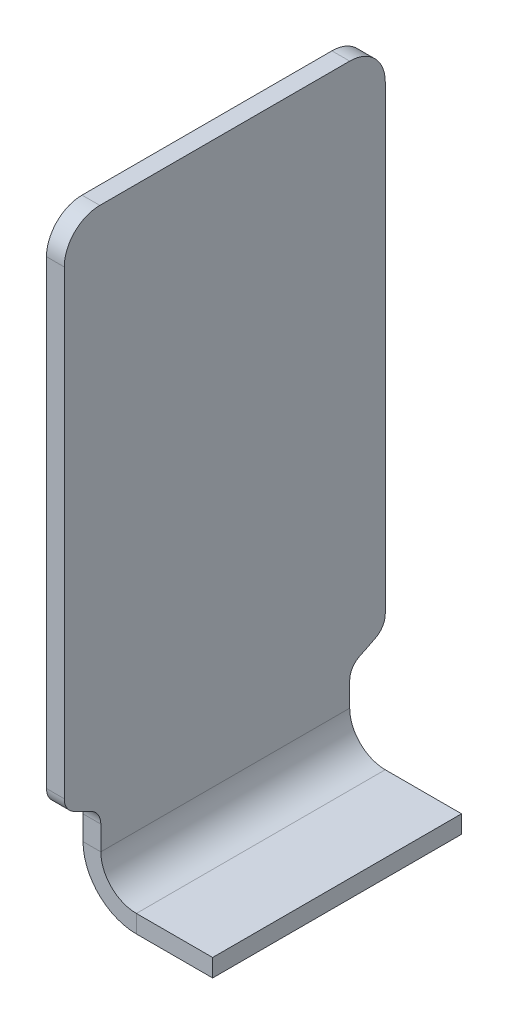
ISO-10303-21;
HEADER;
FILE_DESCRIPTION(('STEP AP214'),'2;1');
FILE_NAME('part.step','',(''),(''),'','','');
FILE_SCHEMA(('AUTOMOTIVE_DESIGN { 1 0 10303 214 1 1 1 1 }'));
ENDSEC;
DATA;
#1=APPLICATION_CONTEXT('core data for automotive mechanical design processes');
#2=APPLICATION_PROTOCOL_DEFINITION('international standard','automotive_design',2000,#1);
#3=PRODUCT_CONTEXT('',#1,'mechanical');
#4=PRODUCT('Part','Part','',(#3));
#5=PRODUCT_RELATED_PRODUCT_CATEGORY('part','',(#4));
#6=PRODUCT_DEFINITION_FORMATION('','',#4);
#7=PRODUCT_DEFINITION_CONTEXT('part definition',#1,'design');
#8=PRODUCT_DEFINITION('design','',#6,#7);
#9=PRODUCT_DEFINITION_SHAPE('','',#8);
#10=(LENGTH_UNIT() NAMED_UNIT(*) SI_UNIT(.MILLI.,.METRE.));
#11=(NAMED_UNIT(*) PLANE_ANGLE_UNIT() SI_UNIT($,.RADIAN.));
#12=(NAMED_UNIT(*) SI_UNIT($,.STERADIAN.) SOLID_ANGLE_UNIT());
#13=UNCERTAINTY_MEASURE_WITH_UNIT(LENGTH_MEASURE(1.E-05),#10,'distance_accuracy_value','');
#14=(GEOMETRIC_REPRESENTATION_CONTEXT(3) GLOBAL_UNCERTAINTY_ASSIGNED_CONTEXT((#13)) GLOBAL_UNIT_ASSIGNED_CONTEXT((#10,
#11,#12)) REPRESENTATION_CONTEXT('',''));
#15=CARTESIAN_POINT('',(0.,0.,0.));
#16=DIRECTION('',(0.,0.,1.));
#17=DIRECTION('',(1.,0.,0.));
#18=AXIS2_PLACEMENT_3D('',#15,#16,#17);
#19=CARTESIAN_POINT('',(-15.725,-5.,35.));
#20=DIRECTION('',(0.,0.,1.));
#21=DIRECTION('',(1.,0.,0.));
#22=AXIS2_PLACEMENT_3D('',#19,#20,#21);
#23=PLANE('',#22);
#24=DIRECTION('',(1.,0.,0.));
#25=VECTOR('',#24,1.);
#26=CARTESIAN_POINT('',(-15.725,0.,35.));
#27=LINE('',#26,#25);
#28=CARTESIAN_POINT('',(-5.72500000000003,0.,35.));
#29=VERTEX_POINT('',#28);
#30=CARTESIAN_POINT('',(15.725,0.,35.));
#31=VERTEX_POINT('',#30);
#32=EDGE_CURVE('E229',#29,#31,#27,.T.);
#33=ORIENTED_EDGE('',*,*,#32,.F.);
#34=DIRECTION('',(0.,-1.,0.));
#35=VECTOR('',#34,1.);
#36=CARTESIAN_POINT('',(-5.72500000000003,0.,35.));
#37=LINE('',#36,#35);
#38=CARTESIAN_POINT('',(-5.72500000000003,-5.,35.));
#39=VERTEX_POINT('',#38);
#40=EDGE_CURVE('E212',#29,#39,#37,.T.);
#41=ORIENTED_EDGE('',*,*,#40,.T.);
#42=DIRECTION('',(1.,0.,0.));
#43=VECTOR('',#42,1.);
#44=CARTESIAN_POINT('',(-15.725,-5.,35.));
#45=LINE('',#44,#43);
#46=CARTESIAN_POINT('',(15.725,-5.,35.));
#47=VERTEX_POINT('',#46);
#48=EDGE_CURVE('E233',#39,#47,#45,.T.);
#49=ORIENTED_EDGE('',*,*,#48,.T.);
#50=DIRECTION('',(0.,1.,0.));
#51=VECTOR('',#50,1.);
#52=CARTESIAN_POINT('',(15.725,-5.,35.));
#53=LINE('',#52,#51);
#54=EDGE_CURVE('E245',#47,#31,#53,.T.);
#55=ORIENTED_EDGE('',*,*,#54,.T.);
#56=EDGE_LOOP('',(#33,#41,#49,#55));
#57=FACE_BOUND('',#56,.T.);
#58=ADVANCED_FACE('F43',(#57),#23,.T.);
#59=CARTESIAN_POINT('',(0.,-5.,0.));
#60=DIRECTION('',(0.,-1.,0.));
#61=DIRECTION('',(0.,0.,-1.));
#62=AXIS2_PLACEMENT_3D('',#59,#60,#61);
#63=PLANE('',#62);
#64=ORIENTED_EDGE('',*,*,#48,.F.);
#65=DIRECTION('',(0.,0.,1.));
#66=VECTOR('',#65,1.);
#67=CARTESIAN_POINT('',(-5.72500000000003,-5.,35.));
#68=LINE('',#67,#66);
#69=CARTESIAN_POINT('',(-5.72500000000003,-5.,-35.));
#70=VERTEX_POINT('',#69);
#71=EDGE_CURVE('E171',#39,#70,#68,.F.);
#72=ORIENTED_EDGE('',*,*,#71,.T.);
#73=DIRECTION('',(-1.,0.,0.));
#74=VECTOR('',#73,1.);
#75=CARTESIAN_POINT('',(-15.725,-5.,-35.));
#76=LINE('',#75,#74);
#77=CARTESIAN_POINT('',(15.725,-5.,-35.));
#78=VERTEX_POINT('',#77);
#79=EDGE_CURVE('E227',#78,#70,#76,.T.);
#80=ORIENTED_EDGE('',*,*,#79,.F.);
#81=DIRECTION('',(0.,0.,-1.));
#82=VECTOR('',#81,1.);
#83=CARTESIAN_POINT('',(15.725,-5.,35.));
#84=LINE('',#83,#82);
#85=EDGE_CURVE('E228',#47,#78,#84,.T.);
#86=ORIENTED_EDGE('',*,*,#85,.F.);
#87=EDGE_LOOP('',(#64,#72,#80,#86));
#88=FACE_BOUND('',#87,.T.);
#89=ADVANCED_FACE('F355',(#88),#63,.T.);
#90=CARTESIAN_POINT('',(0.,0.,0.));
#91=DIRECTION('',(0.,-1.,0.));
#92=DIRECTION('',(0.,0.,-1.));
#93=AXIS2_PLACEMENT_3D('',#90,#91,#92);
#94=PLANE('',#93);
#95=DIRECTION('',(0.,0.,1.));
#96=VECTOR('',#95,1.);
#97=CARTESIAN_POINT('',(-5.72500000000003,0.,35.));
#98=LINE('',#97,#96);
#99=CARTESIAN_POINT('',(-5.72500000000003,0.,-35.));
#100=VERTEX_POINT('',#99);
#101=EDGE_CURVE('E217',#29,#100,#98,.F.);
#102=ORIENTED_EDGE('',*,*,#101,.F.);
#103=ORIENTED_EDGE('',*,*,#32,.T.);
#104=DIRECTION('',(0.,0.,-1.));
#105=VECTOR('',#104,1.);
#106=CARTESIAN_POINT('',(15.725,0.,35.));
#107=LINE('',#106,#105);
#108=CARTESIAN_POINT('',(15.725,0.,-35.));
#109=VERTEX_POINT('',#108);
#110=EDGE_CURVE('E221',#31,#109,#107,.T.);
#111=ORIENTED_EDGE('',*,*,#110,.T.);
#112=DIRECTION('',(-1.,0.,0.));
#113=VECTOR('',#112,1.);
#114=CARTESIAN_POINT('',(-15.725,0.,-35.));
#115=LINE('',#114,#113);
#116=EDGE_CURVE('E236',#109,#100,#115,.T.);
#117=ORIENTED_EDGE('',*,*,#116,.T.);
#118=EDGE_LOOP('',(#102,#103,#111,#117));
#119=FACE_BOUND('',#118,.T.);
#120=ADVANCED_FACE('F357',(#119),#94,.F.);
#121=CARTESIAN_POINT('',(15.725,-5.,35.));
#122=DIRECTION('',(1.,0.,0.));
#123=DIRECTION('',(0.,0.,-1.));
#124=AXIS2_PLACEMENT_3D('',#121,#122,#123);
#125=PLANE('',#124);
#126=ORIENTED_EDGE('',*,*,#110,.F.);
#127=ORIENTED_EDGE('',*,*,#54,.F.);
#128=ORIENTED_EDGE('',*,*,#85,.T.);
#129=DIRECTION('',(0.,1.,0.));
#130=VECTOR('',#129,1.);
#131=CARTESIAN_POINT('',(15.725,-5.,-35.));
#132=LINE('',#131,#130);
#133=EDGE_CURVE('E231',#78,#109,#132,.T.);
#134=ORIENTED_EDGE('',*,*,#133,.T.);
#135=EDGE_LOOP('',(#126,#127,#128,#134));
#136=FACE_BOUND('',#135,.T.);
#137=ADVANCED_FACE('F369',(#136),#125,.T.);
#138=CARTESIAN_POINT('',(-15.725,-5.,-35.));
#139=DIRECTION('',(0.,0.,-1.));
#140=DIRECTION('',(-1.,0.,0.));
#141=AXIS2_PLACEMENT_3D('',#138,#139,#140);
#142=PLANE('',#141);
#143=DIRECTION('',(0.,-1.,0.));
#144=VECTOR('',#143,1.);
#145=CARTESIAN_POINT('',(-5.72500000000003,0.,-35.));
#146=LINE('',#145,#144);
#147=EDGE_CURVE('E222',#100,#70,#146,.T.);
#148=ORIENTED_EDGE('',*,*,#147,.F.);
#149=ORIENTED_EDGE('',*,*,#116,.F.);
#150=ORIENTED_EDGE('',*,*,#133,.F.);
#151=ORIENTED_EDGE('',*,*,#79,.T.);
#152=EDGE_LOOP('',(#148,#149,#150,#151));
#153=FACE_BOUND('',#152,.T.);
#154=ADVANCED_FACE('F364',(#153),#142,.T.);
#155=CARTESIAN_POINT('',(-5.72500000000003,10.,-35.));
#156=DIRECTION('',(0.,0.,-1.));
#157=DIRECTION('',(-1.,0.,0.));
#158=AXIS2_PLACEMENT_3D('',#155,#156,#157);
#159=PLANE('',#158);
#160=DIRECTION('',(-1.,0.,0.));
#161=VECTOR('',#160,1.);
#162=CARTESIAN_POINT('',(-15.725,9.99999999999997,-35.));
#163=LINE('',#162,#161);
#164=CARTESIAN_POINT('',(-15.725,9.99999999999997,-35.));
#165=VERTEX_POINT('',#164);
#166=CARTESIAN_POINT('',(-20.725,9.99999999999995,-35.));
#167=VERTEX_POINT('',#166);
#168=EDGE_CURVE('E320',#165,#167,#163,.T.);
#169=ORIENTED_EDGE('',*,*,#168,.F.);
#170=CARTESIAN_POINT('',(-5.72500000000003,10.,-35.));
#171=DIRECTION('',(0.,0.,1.));
#172=DIRECTION('',(1.,0.,0.));
#173=AXIS2_PLACEMENT_3D('',#170,#171,#172);
#174=CIRCLE('',#173,10.);
#175=EDGE_CURVE('E177',#100,#165,#174,.F.);
#176=ORIENTED_EDGE('',*,*,#175,.F.);
#177=ORIENTED_EDGE('',*,*,#147,.T.);
#178=CARTESIAN_POINT('',(-5.72500000000003,10.,-35.));
#179=DIRECTION('',(0.,0.,1.));
#180=DIRECTION('',(1.,0.,0.));
#181=AXIS2_PLACEMENT_3D('',#178,#179,#180);
#182=CIRCLE('',#181,15.);
#183=EDGE_CURVE('E213',#70,#167,#182,.F.);
#184=ORIENTED_EDGE('',*,*,#183,.T.);
#185=EDGE_LOOP('',(#169,#176,#177,#184));
#186=FACE_BOUND('',#185,.T.);
#187=ADVANCED_FACE('F366',(#186),#159,.T.);
#188=CARTESIAN_POINT('',(-5.72500000000003,10.,35.));
#189=DIRECTION('',(0.,0.,-1.));
#190=DIRECTION('',(-1.,0.,0.));
#191=AXIS2_PLACEMENT_3D('',#188,#189,#190);
#192=PLANE('',#191);
#193=CARTESIAN_POINT('',(-5.72500000000003,10.,35.));
#194=DIRECTION('',(0.,0.,1.));
#195=DIRECTION('',(1.,0.,0.));
#196=AXIS2_PLACEMENT_3D('',#193,#194,#195);
#197=CIRCLE('',#196,10.);
#198=CARTESIAN_POINT('',(-15.725,9.99999999999997,35.));
#199=VERTEX_POINT('',#198);
#200=EDGE_CURVE('E181',#199,#29,#197,.T.);
#201=ORIENTED_EDGE('',*,*,#200,.F.);
#202=DIRECTION('',(-1.,0.,0.));
#203=VECTOR('',#202,1.);
#204=CARTESIAN_POINT('',(-15.725,9.99999999999997,35.));
#205=LINE('',#204,#203);
#206=CARTESIAN_POINT('',(-20.725,9.99999999999995,35.));
#207=VERTEX_POINT('',#206);
#208=EDGE_CURVE('E176',#199,#207,#205,.T.);
#209=ORIENTED_EDGE('',*,*,#208,.T.);
#210=CARTESIAN_POINT('',(-5.72500000000003,10.,35.));
#211=DIRECTION('',(0.,0.,1.));
#212=DIRECTION('',(1.,0.,0.));
#213=AXIS2_PLACEMENT_3D('',#210,#211,#212);
#214=CIRCLE('',#213,15.);
#215=EDGE_CURVE('E167',#207,#39,#214,.T.);
#216=ORIENTED_EDGE('',*,*,#215,.T.);
#217=ORIENTED_EDGE('',*,*,#40,.F.);
#218=EDGE_LOOP('',(#201,#209,#216,#217));
#219=FACE_BOUND('',#218,.T.);
#220=ADVANCED_FACE('F182',(#219),#192,.F.);
#221=CARTESIAN_POINT('',(-5.72500000000003,10.,35.));
#222=DIRECTION('',(0.,0.,1.));
#223=DIRECTION('',(-1.,0.,0.));
#224=AXIS2_PLACEMENT_3D('',#221,#222,#223);
#225=CYLINDRICAL_SURFACE('',#224,15.);
#226=ORIENTED_EDGE('',*,*,#71,.F.);
#227=ORIENTED_EDGE('',*,*,#215,.F.);
#228=DIRECTION('',(0.,0.,-1.));
#229=VECTOR('',#228,1.);
#230=CARTESIAN_POINT('',(-20.725,9.99999999999995,0.));
#231=LINE('',#230,#229);
#232=EDGE_CURVE('E168',#207,#167,#231,.T.);
#233=ORIENTED_EDGE('',*,*,#232,.T.);
#234=ORIENTED_EDGE('',*,*,#183,.F.);
#235=EDGE_LOOP('',(#226,#227,#233,#234));
#236=FACE_BOUND('',#235,.T.);
#237=ADVANCED_FACE('F169',(#236),#225,.T.);
#238=CARTESIAN_POINT('',(-5.72500000000003,10.,35.));
#239=DIRECTION('',(0.,0.,1.));
#240=DIRECTION('',(-1.,0.,0.));
#241=AXIS2_PLACEMENT_3D('',#238,#239,#240);
#242=CYLINDRICAL_SURFACE('',#241,10.);
#243=ORIENTED_EDGE('',*,*,#101,.T.);
#244=ORIENTED_EDGE('',*,*,#175,.T.);
#245=DIRECTION('',(0.,0.,1.));
#246=VECTOR('',#245,1.);
#247=CARTESIAN_POINT('',(-15.725,9.99999999999997,-35.));
#248=LINE('',#247,#246);
#249=EDGE_CURVE('E186',#165,#199,#248,.T.);
#250=ORIENTED_EDGE('',*,*,#249,.T.);
#251=ORIENTED_EDGE('',*,*,#200,.T.);
#252=EDGE_LOOP('',(#243,#244,#250,#251));
#253=FACE_BOUND('',#252,.T.);
#254=ADVANCED_FACE('F417',(#253),#242,.F.);
#255=CARTESIAN_POINT('',(-20.7250000000006,167.6,35.));
#256=DIRECTION('',(0.,0.,-1.));
#257=DIRECTION('',(-1.,0.,0.));
#258=AXIS2_PLACEMENT_3D('',#255,#256,#257);
#259=PLANE('',#258);
#260=DIRECTION('',(0.,1.,0.));
#261=VECTOR('',#260,1.);
#262=CARTESIAN_POINT('',(-15.7250000000006,167.6,35.));
#263=LINE('',#262,#261);
#264=CARTESIAN_POINT('',(-15.7250000000001,16.7565603019629,35.));
#265=VERTEX_POINT('',#264);
#266=EDGE_CURVE('E194',#199,#265,#263,.T.);
#267=ORIENTED_EDGE('',*,*,#266,.T.);
#268=DIRECTION('',(-1.,0.,0.));
#269=VECTOR('',#268,1.);
#270=CARTESIAN_POINT('',(-20.7250000000001,16.7565603019629,35.));
#271=LINE('',#270,#269);
#272=CARTESIAN_POINT('',(-20.7250000000001,16.7565603019629,35.));
#273=VERTEX_POINT('',#272);
#274=EDGE_CURVE('E199',#265,#273,#271,.T.);
#275=ORIENTED_EDGE('',*,*,#274,.T.);
#276=DIRECTION('',(0.,1.,0.));
#277=VECTOR('',#276,1.);
#278=CARTESIAN_POINT('',(-20.7250000000006,167.6,35.));
#279=LINE('',#278,#277);
#280=EDGE_CURVE('E195',#207,#273,#279,.T.);
#281=ORIENTED_EDGE('',*,*,#280,.F.);
#282=ORIENTED_EDGE('',*,*,#208,.F.);
#283=EDGE_LOOP('',(#267,#275,#281,#282));
#284=FACE_BOUND('',#283,.T.);
#285=ADVANCED_FACE('F196',(#284),#259,.F.);
#286=CARTESIAN_POINT('',(-20.725,0.,-35.));
#287=DIRECTION('',(0.,0.,1.));
#288=DIRECTION('',(1.,0.,0.));
#289=AXIS2_PLACEMENT_3D('',#286,#287,#288);
#290=PLANE('',#289);
#291=DIRECTION('',(0.,-1.,0.));
#292=VECTOR('',#291,1.);
#293=CARTESIAN_POINT('',(-20.725,0.,-35.));
#294=LINE('',#293,#292);
#295=CARTESIAN_POINT('',(-20.7250000000001,16.7565603019744,-35.));
#296=VERTEX_POINT('',#295);
#297=EDGE_CURVE('E192',#296,#167,#294,.T.);
#298=ORIENTED_EDGE('',*,*,#297,.F.);
#299=DIRECTION('',(-1.,0.,0.));
#300=VECTOR('',#299,1.);
#301=CARTESIAN_POINT('',(-20.7250000000001,16.7565603019744,-35.));
#302=LINE('',#301,#300);
#303=CARTESIAN_POINT('',(-15.7250000000001,16.7565603019744,-35.));
#304=VERTEX_POINT('',#303);
#305=EDGE_CURVE('E244',#296,#304,#302,.F.);
#306=ORIENTED_EDGE('',*,*,#305,.T.);
#307=DIRECTION('',(0.,-1.,0.));
#308=VECTOR('',#307,1.);
#309=CARTESIAN_POINT('',(-15.725,0.,-35.));
#310=LINE('',#309,#308);
#311=EDGE_CURVE('E205',#304,#165,#310,.T.);
#312=ORIENTED_EDGE('',*,*,#311,.T.);
#313=ORIENTED_EDGE('',*,*,#168,.T.);
#314=EDGE_LOOP('',(#298,#306,#312,#313));
#315=FACE_BOUND('',#314,.T.);
#316=ADVANCED_FACE('F412',(#315),#290,.F.);
#317=CARTESIAN_POINT('',(-20.725,0.,0.));
#318=DIRECTION('',(1.,0.,0.));
#319=DIRECTION('',(0.,1.,0.));
#320=AXIS2_PLACEMENT_3D('',#317,#318,#319);
#321=PLANE('',#320);
#322=DIRECTION('',(0.,1.,0.));
#323=VECTOR('',#322,1.);
#324=CARTESIAN_POINT('',(-20.7250000000001,25.1453622540292,45.2805471709599));
#325=LINE('',#324,#323);
#326=CARTESIAN_POINT('',(-20.7250000000001,28.0753004708564,45.2805471709599));
#327=VERTEX_POINT('',#326);
#328=CARTESIAN_POINT('',(-20.7250000000005,157.6,45.2805471709599));
#329=VERTEX_POINT('',#328);
#330=EDGE_CURVE('E301',#327,#329,#325,.T.);
#331=ORIENTED_EDGE('',*,*,#330,.T.);
#332=CARTESIAN_POINT('',(-20.7250000000005,157.6,35.2805471709599));
#333=DIRECTION('',(1.,0.,0.));
#334=DIRECTION('',(0.,1.,0.));
#335=AXIS2_PLACEMENT_3D('',#332,#333,#334);
#336=CIRCLE('',#335,10.);
#337=CARTESIAN_POINT('',(-20.7250000000006,167.6,35.2805471709598));
#338=VERTEX_POINT('',#337);
#339=EDGE_CURVE('E64',#329,#338,#336,.F.);
#340=ORIENTED_EDGE('',*,*,#339,.T.);
#341=DIRECTION('',(0.,0.,-1.));
#342=VECTOR('',#341,1.);
#343=CARTESIAN_POINT('',(-20.7250000000006,167.6,-35.));
#344=LINE('',#343,#342);
#345=CARTESIAN_POINT('',(-20.7250000000006,167.6,-35.));
#346=VERTEX_POINT('',#345);
#347=EDGE_CURVE('E203',#338,#346,#344,.T.);
#348=ORIENTED_EDGE('',*,*,#347,.T.);
#349=CARTESIAN_POINT('',(-20.7250000000005,157.6,-35.));
#350=DIRECTION('',(1.,0.,0.));
#351=DIRECTION('',(0.,1.,0.));
#352=AXIS2_PLACEMENT_3D('',#349,#350,#351);
#353=CIRCLE('',#352,10.);
#354=CARTESIAN_POINT('',(-20.7250000000005,157.6,-45.));
#355=VERTEX_POINT('',#354);
#356=EDGE_CURVE('E287',#346,#355,#353,.F.);
#357=ORIENTED_EDGE('',*,*,#356,.T.);
#358=DIRECTION('',(0.,-1.,0.));
#359=VECTOR('',#358,1.);
#360=CARTESIAN_POINT('',(-20.7250000000006,167.6,-45.));
#361=LINE('',#360,#359);
#362=CARTESIAN_POINT('',(-20.7250000000001,27.9250000000467,-45.));
#363=VERTEX_POINT('',#362);
#364=EDGE_CURVE('E322',#355,#363,#361,.T.);
#365=ORIENTED_EDGE('',*,*,#364,.T.);
#366=CARTESIAN_POINT('',(-20.7250000000001,27.9250000000467,-40.));
#367=DIRECTION('',(1.,0.,0.));
#368=DIRECTION('',(0.,1.,0.));
#369=AXIS2_PLACEMENT_3D('',#366,#367,#368);
#370=CIRCLE('',#369,5.);
#371=CARTESIAN_POINT('',(-20.7250000000001,23.5132352941652,-42.3529411764722));
#372=VERTEX_POINT('',#371);
#373=EDGE_CURVE('E277',#363,#372,#370,.F.);
#374=ORIENTED_EDGE('',*,*,#373,.T.);
#375=CARTESIAN_POINT('',(-20.7250000000004,102.925000000005,1.24344978758018E-11));
#376=DIRECTION('',(-1.,0.,0.));
#377=DIRECTION('',(0.,1.,0.));
#378=AXIS2_PLACEMENT_3D('',#375,#376,#377);
#379=CIRCLE('',#378,89.999999999969);
#380=CARTESIAN_POINT('',(-20.7250000000001,21.2917413387144,-37.8947368421039));
#381=VERTEX_POINT('',#380);
#382=EDGE_CURVE('E310',#372,#381,#379,.T.);
#383=ORIENTED_EDGE('',*,*,#382,.T.);
#384=CARTESIAN_POINT('',(-20.7250000000001,16.7565603019744,-40.));
#385=DIRECTION('',(1.,0.,0.));
#386=DIRECTION('',(0.,1.,0.));
#387=AXIS2_PLACEMENT_3D('',#384,#385,#386);
#388=CIRCLE('',#387,5.);
#389=EDGE_CURVE('E254',#381,#296,#388,.T.);
#390=ORIENTED_EDGE('',*,*,#389,.T.);
#391=ORIENTED_EDGE('',*,*,#297,.T.);
#392=ORIENTED_EDGE('',*,*,#232,.F.);
#393=ORIENTED_EDGE('',*,*,#280,.T.);
#394=CARTESIAN_POINT('',(-20.7250000000001,16.7565603019629,40.));
#395=DIRECTION('',(1.,0.,0.));
#396=DIRECTION('',(0.,1.,0.));
#397=AXIS2_PLACEMENT_3D('',#394,#395,#396);
#398=CIRCLE('',#397,5.);
#399=CARTESIAN_POINT('',(-20.7250000000001,21.2917413387034,37.8947368421052));
#400=VERTEX_POINT('',#399);
#401=EDGE_CURVE('E257',#273,#400,#398,.T.);
#402=ORIENTED_EDGE('',*,*,#401,.T.);
#403=CARTESIAN_POINT('',(-20.7250000000001,23.6723769691402,42.6499911221929));
#404=VERTEX_POINT('',#403);
#405=EDGE_CURVE('E311',#400,#404,#379,.T.);
#406=ORIENTED_EDGE('',*,*,#405,.T.);
#407=CARTESIAN_POINT('',(-20.7250000000001,28.0753004708564,40.2805471709599));
#408=DIRECTION('',(1.,0.,0.));
#409=DIRECTION('',(0.,1.,0.));
#410=AXIS2_PLACEMENT_3D('',#407,#408,#409);
#411=CIRCLE('',#410,5.);
#412=EDGE_CURVE('E270',#404,#327,#411,.F.);
#413=ORIENTED_EDGE('',*,*,#412,.T.);
#414=EDGE_LOOP('',(#331,#340,#348,#357,#365,#374,#383,#390,#391,#392,#393,#402,#406,#413));
#415=FACE_BOUND('',#414,.T.);
#416=ADVANCED_FACE('F191',(#415),#321,.F.);
#417=CARTESIAN_POINT('',(-15.725,0.,0.));
#418=DIRECTION('',(1.,0.,0.));
#419=DIRECTION('',(0.,1.,0.));
#420=AXIS2_PLACEMENT_3D('',#417,#418,#419);
#421=PLANE('',#420);
#422=DIRECTION('',(0.,0.,-1.));
#423=VECTOR('',#422,1.);
#424=CARTESIAN_POINT('',(-15.7250000000006,167.6,-35.));
#425=LINE('',#424,#423);
#426=CARTESIAN_POINT('',(-15.7250000000006,167.6,35.2805471709598));
#427=VERTEX_POINT('',#426);
#428=CARTESIAN_POINT('',(-15.7250000000006,167.6,-35.));
#429=VERTEX_POINT('',#428);
#430=EDGE_CURVE('E202',#427,#429,#425,.T.);
#431=ORIENTED_EDGE('',*,*,#430,.F.);
#432=CARTESIAN_POINT('',(-15.7250000000005,157.6,35.2805471709599));
#433=DIRECTION('',(1.,0.,0.));
#434=DIRECTION('',(0.,1.,0.));
#435=AXIS2_PLACEMENT_3D('',#432,#433,#434);
#436=CIRCLE('',#435,10.);
#437=CARTESIAN_POINT('',(-15.7250000000005,157.6,45.2805471709599));
#438=VERTEX_POINT('',#437);
#439=EDGE_CURVE('E11',#427,#438,#436,.T.);
#440=ORIENTED_EDGE('',*,*,#439,.T.);
#441=DIRECTION('',(0.,1.,0.));
#442=VECTOR('',#441,1.);
#443=CARTESIAN_POINT('',(-15.7250000000001,25.1453622540292,45.2805471709599));
#444=LINE('',#443,#442);
#445=CARTESIAN_POINT('',(-15.7250000000001,28.0753004708565,45.2805471709599));
#446=VERTEX_POINT('',#445);
#447=EDGE_CURVE('E302',#446,#438,#444,.T.);
#448=ORIENTED_EDGE('',*,*,#447,.F.);
#449=CARTESIAN_POINT('',(-15.7250000000001,28.0753004708565,40.2805471709599));
#450=DIRECTION('',(1.,0.,0.));
#451=DIRECTION('',(0.,1.,0.));
#452=AXIS2_PLACEMENT_3D('',#449,#450,#451);
#453=CIRCLE('',#452,5.);
#454=CARTESIAN_POINT('',(-15.7250000000001,23.6723769691473,42.6499911221891));
#455=VERTEX_POINT('',#454);
#456=EDGE_CURVE('E271',#446,#455,#453,.T.);
#457=ORIENTED_EDGE('',*,*,#456,.T.);
#458=CARTESIAN_POINT('',(-15.7250000000004,102.925000000005,1.24344978758018E-11));
#459=DIRECTION('',(-1.,0.,0.));
#460=DIRECTION('',(0.,-1.,0.));
#461=AXIS2_PLACEMENT_3D('',#458,#459,#460);
#462=CIRCLE('',#461,89.999999999961);
#463=CARTESIAN_POINT('',(-15.7250000000001,21.2917413387107,37.8947368421018));
#464=VERTEX_POINT('',#463);
#465=EDGE_CURVE('E313',#464,#455,#462,.T.);
#466=ORIENTED_EDGE('',*,*,#465,.F.);
#467=CARTESIAN_POINT('',(-15.7250000000001,16.7565603019629,40.));
#468=DIRECTION('',(1.,0.,0.));
#469=DIRECTION('',(0.,1.,0.));
#470=AXIS2_PLACEMENT_3D('',#467,#468,#469);
#471=CIRCLE('',#470,5.);
#472=EDGE_CURVE('E265',#464,#265,#471,.F.);
#473=ORIENTED_EDGE('',*,*,#472,.T.);
#474=ORIENTED_EDGE('',*,*,#266,.F.);
#475=ORIENTED_EDGE('',*,*,#249,.F.);
#476=ORIENTED_EDGE('',*,*,#311,.F.);
#477=CARTESIAN_POINT('',(-15.7250000000001,16.7565603019744,-40.));
#478=DIRECTION('',(1.,0.,0.));
#479=DIRECTION('',(0.,1.,0.));
#480=AXIS2_PLACEMENT_3D('',#477,#478,#479);
#481=CIRCLE('',#480,5.);
#482=CARTESIAN_POINT('',(-15.7250000000001,21.2917413387217,-37.8947368421005));
#483=VERTEX_POINT('',#482);
#484=EDGE_CURVE('E252',#304,#483,#481,.F.);
#485=ORIENTED_EDGE('',*,*,#484,.T.);
#486=CARTESIAN_POINT('',(-15.7250000000001,23.5132352941723,-42.3529411764684));
#487=VERTEX_POINT('',#486);
#488=EDGE_CURVE('E321',#487,#483,#462,.T.);
#489=ORIENTED_EDGE('',*,*,#488,.F.);
#490=CARTESIAN_POINT('',(-15.7250000000001,27.9250000000467,-40.));
#491=DIRECTION('',(1.,0.,0.));
#492=DIRECTION('',(0.,1.,0.));
#493=AXIS2_PLACEMENT_3D('',#490,#491,#492);
#494=CIRCLE('',#493,5.);
#495=CARTESIAN_POINT('',(-15.7250000000001,27.9250000000467,-45.));
#496=VERTEX_POINT('',#495);
#497=EDGE_CURVE('E278',#487,#496,#494,.T.);
#498=ORIENTED_EDGE('',*,*,#497,.T.);
#499=DIRECTION('',(0.,-1.,0.));
#500=VECTOR('',#499,1.);
#501=CARTESIAN_POINT('',(-15.7250000000006,167.6,-45.));
#502=LINE('',#501,#500);
#503=CARTESIAN_POINT('',(-15.7250000000005,157.6,-45.));
#504=VERTEX_POINT('',#503);
#505=EDGE_CURVE('E306',#504,#496,#502,.T.);
#506=ORIENTED_EDGE('',*,*,#505,.F.);
#507=CARTESIAN_POINT('',(-15.7250000000005,157.6,-35.));
#508=DIRECTION('',(1.,0.,0.));
#509=DIRECTION('',(0.,1.,0.));
#510=AXIS2_PLACEMENT_3D('',#507,#508,#509);
#511=CIRCLE('',#510,10.);
#512=EDGE_CURVE('E286',#504,#429,#511,.T.);
#513=ORIENTED_EDGE('',*,*,#512,.T.);
#514=EDGE_LOOP('',(#431,#440,#448,#457,#466,#473,#474,#475,#476,#485,#489,#498,#506,#513));
#515=FACE_BOUND('',#514,.T.);
#516=ADVANCED_FACE('F336',(#515),#421,.T.);
#517=CARTESIAN_POINT('',(-20.7250000000006,167.6,-35.));
#518=DIRECTION('',(0.,-1.,0.));
#519=DIRECTION('',(1.,0.,0.));
#520=AXIS2_PLACEMENT_3D('',#517,#518,#519);
#521=PLANE('',#520);
#522=ORIENTED_EDGE('',*,*,#347,.F.);
#523=DIRECTION('',(-1.,0.,0.));
#524=VECTOR('',#523,1.);
#525=CARTESIAN_POINT('',(-15.7250000000006,167.6,35.2805471709599));
#526=LINE('',#525,#524);
#527=EDGE_CURVE('E51',#338,#427,#526,.F.);
#528=ORIENTED_EDGE('',*,*,#527,.T.);
#529=ORIENTED_EDGE('',*,*,#430,.T.);
#530=DIRECTION('',(-1.,0.,0.));
#531=VECTOR('',#530,1.);
#532=CARTESIAN_POINT('',(-20.7250000000006,167.6,-35.));
#533=LINE('',#532,#531);
#534=EDGE_CURVE('E281',#429,#346,#533,.T.);
#535=ORIENTED_EDGE('',*,*,#534,.T.);
#536=EDGE_LOOP('',(#522,#528,#529,#535));
#537=FACE_BOUND('',#536,.T.);
#538=ADVANCED_FACE('F404',(#537),#521,.F.);
#539=CARTESIAN_POINT('',(-15.7250000000006,167.6,-45.));
#540=DIRECTION('',(0.,0.,-1.));
#541=DIRECTION('',(-1.,0.,0.));
#542=AXIS2_PLACEMENT_3D('',#539,#540,#541);
#543=PLANE('',#542);
#544=ORIENTED_EDGE('',*,*,#364,.F.);
#545=DIRECTION('',(-1.,0.,0.));
#546=VECTOR('',#545,1.);
#547=CARTESIAN_POINT('',(-15.7250000000005,157.6,-45.));
#548=LINE('',#547,#546);
#549=EDGE_CURVE('E288',#355,#504,#548,.F.);
#550=ORIENTED_EDGE('',*,*,#549,.T.);
#551=ORIENTED_EDGE('',*,*,#505,.T.);
#552=DIRECTION('',(-1.,0.,0.));
#553=VECTOR('',#552,1.);
#554=CARTESIAN_POINT('',(-15.7250000000001,27.9250000000467,-45.));
#555=LINE('',#554,#553);
#556=EDGE_CURVE('E272',#496,#363,#555,.T.);
#557=ORIENTED_EDGE('',*,*,#556,.T.);
#558=EDGE_LOOP('',(#544,#550,#551,#557));
#559=FACE_BOUND('',#558,.T.);
#560=ADVANCED_FACE('F396',(#559),#543,.T.);
#561=CARTESIAN_POINT('',(-15.7250000000004,102.925000000005,1.24344978758018E-11));
#562=DIRECTION('',(-1.,0.,0.));
#563=DIRECTION('',(0.,-1.,0.));
#564=AXIS2_PLACEMENT_3D('',#561,#562,#563);
#565=CYLINDRICAL_SURFACE('',#564,89.999999999969);
#566=ORIENTED_EDGE('',*,*,#382,.F.);
#567=DIRECTION('',(-1.,0.,0.));
#568=VECTOR('',#567,1.);
#569=CARTESIAN_POINT('',(-15.7250000000001,23.5132352941652,-42.3529411764722));
#570=LINE('',#569,#568);
#571=EDGE_CURVE('E279',#372,#487,#570,.F.);
#572=ORIENTED_EDGE('',*,*,#571,.T.);
#573=ORIENTED_EDGE('',*,*,#488,.T.);
#574=DIRECTION('',(-1.,0.,0.));
#575=VECTOR('',#574,1.);
#576=CARTESIAN_POINT('',(-15.7250000000001,21.2917413387144,-37.8947368421039));
#577=LINE('',#576,#575);
#578=EDGE_CURVE('E247',#483,#381,#577,.T.);
#579=ORIENTED_EDGE('',*,*,#578,.T.);
#580=EDGE_LOOP('',(#566,#572,#573,#579));
#581=FACE_BOUND('',#580,.T.);
#582=ADVANCED_FACE('F400',(#581),#565,.T.);
#583=ORIENTED_EDGE('',*,*,#465,.T.);
#584=DIRECTION('',(-1.,0.,0.));
#585=VECTOR('',#584,1.);
#586=CARTESIAN_POINT('',(-15.7250000000001,23.6723769691402,42.6499911221929));
#587=LINE('',#586,#585);
#588=EDGE_CURVE('E262',#455,#404,#587,.T.);
#589=ORIENTED_EDGE('',*,*,#588,.T.);
#590=ORIENTED_EDGE('',*,*,#405,.F.);
#591=DIRECTION('',(-1.,0.,0.));
#592=VECTOR('',#591,1.);
#593=CARTESIAN_POINT('',(-15.7250000000001,21.2917413387034,37.8947368421052));
#594=LINE('',#593,#592);
#595=EDGE_CURVE('E256',#400,#464,#594,.F.);
#596=ORIENTED_EDGE('',*,*,#595,.T.);
#597=EDGE_LOOP('',(#583,#589,#590,#596));
#598=FACE_BOUND('',#597,.T.);
#599=ADVANCED_FACE('F332',(#598),#565,.T.);
#600=CARTESIAN_POINT('',(-15.7250000000001,25.1453622540292,45.2805471709599));
#601=DIRECTION('',(0.,0.,1.));
#602=DIRECTION('',(1.,0.,0.));
#603=AXIS2_PLACEMENT_3D('',#600,#601,#602);
#604=PLANE('',#603);
#605=ORIENTED_EDGE('',*,*,#447,.T.);
#606=DIRECTION('',(-1.,0.,0.));
#607=VECTOR('',#606,1.);
#608=CARTESIAN_POINT('',(-20.7250000000005,157.6,45.2805471709599));
#609=LINE('',#608,#607);
#610=EDGE_CURVE('E291',#438,#329,#609,.T.);
#611=ORIENTED_EDGE('',*,*,#610,.T.);
#612=ORIENTED_EDGE('',*,*,#330,.F.);
#613=DIRECTION('',(-1.,0.,0.));
#614=VECTOR('',#613,1.);
#615=CARTESIAN_POINT('',(-15.7250000000001,28.0753004708565,45.2805471709599));
#616=LINE('',#615,#614);
#617=EDGE_CURVE('E267',#327,#446,#616,.F.);
#618=ORIENTED_EDGE('',*,*,#617,.T.);
#619=EDGE_LOOP('',(#605,#611,#612,#618));
#620=FACE_BOUND('',#619,.T.);
#621=ADVANCED_FACE('F299',(#620),#604,.T.);
#622=CARTESIAN_POINT('',(-15.7250000000001,16.7565603019744,-40.));
#623=DIRECTION('',(-1.,0.,0.));
#624=DIRECTION('',(0.,-1.,0.));
#625=AXIS2_PLACEMENT_3D('',#622,#623,#624);
#626=CYLINDRICAL_SURFACE('',#625,5.);
#627=ORIENTED_EDGE('',*,*,#389,.F.);
#628=ORIENTED_EDGE('',*,*,#578,.F.);
#629=ORIENTED_EDGE('',*,*,#484,.F.);
#630=ORIENTED_EDGE('',*,*,#305,.F.);
#631=EDGE_LOOP('',(#627,#628,#629,#630));
#632=FACE_BOUND('',#631,.T.);
#633=ADVANCED_FACE('F373',(#632),#626,.F.);
#634=CARTESIAN_POINT('',(-15.7250000000001,16.7565603019629,40.));
#635=DIRECTION('',(-1.,0.,0.));
#636=DIRECTION('',(0.,-1.,0.));
#637=AXIS2_PLACEMENT_3D('',#634,#635,#636);
#638=CYLINDRICAL_SURFACE('',#637,5.);
#639=ORIENTED_EDGE('',*,*,#472,.F.);
#640=ORIENTED_EDGE('',*,*,#595,.F.);
#641=ORIENTED_EDGE('',*,*,#401,.F.);
#642=ORIENTED_EDGE('',*,*,#274,.F.);
#643=EDGE_LOOP('',(#639,#640,#641,#642));
#644=FACE_BOUND('',#643,.T.);
#645=ADVANCED_FACE('F338',(#644),#638,.F.);
#646=CARTESIAN_POINT('',(-15.7250000000001,28.0753004708565,40.2805471709599));
#647=DIRECTION('',(-1.,0.,0.));
#648=DIRECTION('',(0.,-1.,0.));
#649=AXIS2_PLACEMENT_3D('',#646,#647,#648);
#650=CYLINDRICAL_SURFACE('',#649,5.);
#651=ORIENTED_EDGE('',*,*,#456,.F.);
#652=ORIENTED_EDGE('',*,*,#617,.F.);
#653=ORIENTED_EDGE('',*,*,#412,.F.);
#654=ORIENTED_EDGE('',*,*,#588,.F.);
#655=EDGE_LOOP('',(#651,#652,#653,#654));
#656=FACE_BOUND('',#655,.T.);
#657=ADVANCED_FACE('F345',(#656),#650,.T.);
#658=CARTESIAN_POINT('',(-15.7250000000001,27.9250000000467,-40.));
#659=DIRECTION('',(-1.,0.,0.));
#660=DIRECTION('',(0.,-1.,0.));
#661=AXIS2_PLACEMENT_3D('',#658,#659,#660);
#662=CYLINDRICAL_SURFACE('',#661,5.);
#663=ORIENTED_EDGE('',*,*,#497,.F.);
#664=ORIENTED_EDGE('',*,*,#571,.F.);
#665=ORIENTED_EDGE('',*,*,#373,.F.);
#666=ORIENTED_EDGE('',*,*,#556,.F.);
#667=EDGE_LOOP('',(#663,#664,#665,#666));
#668=FACE_BOUND('',#667,.T.);
#669=ADVANCED_FACE('F349',(#668),#662,.T.);
#670=CARTESIAN_POINT('',(-20.7250000000005,157.6,-35.));
#671=DIRECTION('',(1.,0.,0.));
#672=DIRECTION('',(0.,1.,0.));
#673=AXIS2_PLACEMENT_3D('',#670,#671,#672);
#674=CYLINDRICAL_SURFACE('',#673,10.);
#675=ORIENTED_EDGE('',*,*,#512,.F.);
#676=ORIENTED_EDGE('',*,*,#549,.F.);
#677=ORIENTED_EDGE('',*,*,#356,.F.);
#678=ORIENTED_EDGE('',*,*,#534,.F.);
#679=EDGE_LOOP('',(#675,#676,#677,#678));
#680=FACE_BOUND('',#679,.T.);
#681=ADVANCED_FACE('F344',(#680),#674,.T.);
#682=CARTESIAN_POINT('',(-15.7250000000005,157.6,35.2805471709599));
#683=DIRECTION('',(1.,0.,0.));
#684=DIRECTION('',(0.,1.,0.));
#685=AXIS2_PLACEMENT_3D('',#682,#683,#684);
#686=CYLINDRICAL_SURFACE('',#685,10.);
#687=ORIENTED_EDGE('',*,*,#439,.F.);
#688=ORIENTED_EDGE('',*,*,#527,.F.);
#689=ORIENTED_EDGE('',*,*,#339,.F.);
#690=ORIENTED_EDGE('',*,*,#610,.F.);
#691=EDGE_LOOP('',(#687,#688,#689,#690));
#692=FACE_BOUND('',#691,.T.);
#693=ADVANCED_FACE('F44',(#692),#686,.T.);
#694=CLOSED_SHELL('',(#58,#89,#120,#137,#154,#187,#220,#237,#254,#285,#316,#416,#516,#538,#560,
#582,#599,#621,#633,#645,#657,#669,#681,#693));
#695=MANIFOLD_SOLID_BREP('B2',#694);
#696=ADVANCED_BREP_SHAPE_REPRESENTATION('',(#18,#695),#14);
#697=SHAPE_DEFINITION_REPRESENTATION(#9,#696);
ENDSEC;
END-ISO-10303-21;
